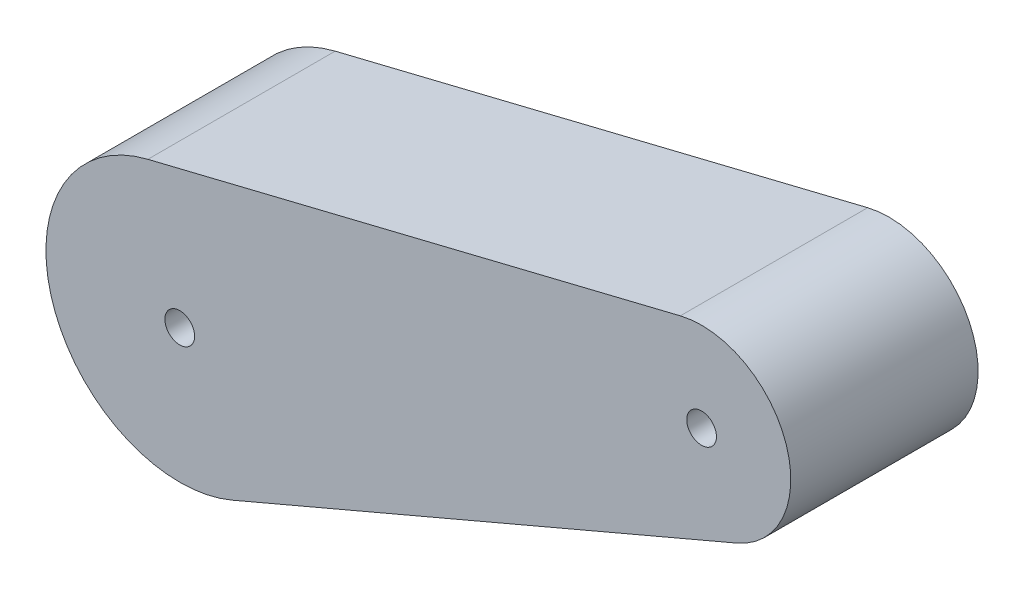
ISO-10303-21;
HEADER;
FILE_DESCRIPTION(('STEP AP214'),'2;1');
FILE_NAME('part.step','',(''),(''),'','','');
FILE_SCHEMA(('AUTOMOTIVE_DESIGN { 1 0 10303 214 1 1 1 1 }'));
ENDSEC;
DATA;
#1=APPLICATION_CONTEXT('core data for automotive mechanical design processes');
#2=APPLICATION_PROTOCOL_DEFINITION('international standard','automotive_design',2000,#1);
#3=PRODUCT_CONTEXT('',#1,'mechanical');
#4=PRODUCT('Part','Part','',(#3));
#5=PRODUCT_RELATED_PRODUCT_CATEGORY('part','',(#4));
#6=PRODUCT_DEFINITION_FORMATION('','',#4);
#7=PRODUCT_DEFINITION_CONTEXT('part definition',#1,'design');
#8=PRODUCT_DEFINITION('design','',#6,#7);
#9=PRODUCT_DEFINITION_SHAPE('','',#8);
#10=(LENGTH_UNIT() NAMED_UNIT(*) SI_UNIT(.MILLI.,.METRE.));
#11=(NAMED_UNIT(*) PLANE_ANGLE_UNIT() SI_UNIT($,.RADIAN.));
#12=(NAMED_UNIT(*) SI_UNIT($,.STERADIAN.) SOLID_ANGLE_UNIT());
#13=UNCERTAINTY_MEASURE_WITH_UNIT(LENGTH_MEASURE(1.E-05),#10,'distance_accuracy_value','');
#14=(GEOMETRIC_REPRESENTATION_CONTEXT(3) GLOBAL_UNCERTAINTY_ASSIGNED_CONTEXT((#13)) GLOBAL_UNIT_ASSIGNED_CONTEXT((#10,
#11,#12)) REPRESENTATION_CONTEXT('',''));
#15=CARTESIAN_POINT('',(0.,0.,0.));
#16=DIRECTION('',(0.,0.,1.));
#17=DIRECTION('',(1.,0.,0.));
#18=AXIS2_PLACEMENT_3D('',#15,#16,#17);
#19=CARTESIAN_POINT('',(0.,0.,31.5));
#20=DIRECTION('',(0.,0.,1.));
#21=DIRECTION('',(1.,0.,0.));
#22=AXIS2_PLACEMENT_3D('',#19,#20,#21);
#23=PLANE('',#22);
#24=CARTESIAN_POINT('',(175.503634341575,58.5104634479909,31.5));
#25=DIRECTION('',(0.,0.,1.));
#26=DIRECTION('',(1.,0.,0.));
#27=AXIS2_PLACEMENT_3D('',#24,#25,#26);
#28=CIRCLE('',#27,5.00000000000002);
#29=CARTESIAN_POINT('',(180.503634341575,58.5104634479909,31.5));
#30=VERTEX_POINT('',#29);
#31=EDGE_CURVE('E100',#30,#30,#28,.T.);
#32=ORIENTED_EDGE('',*,*,#31,.F.);
#33=EDGE_LOOP('',(#32));
#34=FACE_BOUND('',#33,.T.);
#35=CARTESIAN_POINT('',(0.,0.,31.5));
#36=DIRECTION('',(0.,0.,1.));
#37=DIRECTION('',(1.,0.,0.));
#38=AXIS2_PLACEMENT_3D('',#35,#36,#37);
#39=CIRCLE('',#38,45.);
#40=CARTESIAN_POINT('',(-10.7240579663241,43.7034847664911,31.5));
#41=VERTEX_POINT('',#40);
#42=CARTESIAN_POINT('',(17.6467725422518,-41.3955482973958,31.5));
#43=VERTEX_POINT('',#42);
#44=EDGE_CURVE('E85',#41,#43,#39,.T.);
#45=ORIENTED_EDGE('',*,*,#44,.T.);
#46=DIRECTION('',(0.919901073275462,0.39215050093893,0.));
#47=VECTOR('',#46,1.);
#48=CARTESIAN_POINT('',(17.6467725422518,-41.3955482973958,31.5));
#49=LINE('',#48,#47);
#50=CARTESIAN_POINT('',(187.268149369743,30.913431249727,31.5));
#51=VERTEX_POINT('',#50);
#52=EDGE_CURVE('E80',#43,#51,#49,.T.);
#53=ORIENTED_EDGE('',*,*,#52,.T.);
#54=CARTESIAN_POINT('',(175.503634341575,58.5104634479909,31.5));
#55=DIRECTION('',(0.,0.,1.));
#56=DIRECTION('',(1.,0.,0.));
#57=AXIS2_PLACEMENT_3D('',#54,#55,#56);
#58=CIRCLE('',#57,30.);
#59=CARTESIAN_POINT('',(168.354262364026,87.6461199589849,31.5));
#60=VERTEX_POINT('',#59);
#61=EDGE_CURVE('E83',#51,#60,#58,.T.);
#62=ORIENTED_EDGE('',*,*,#61,.T.);
#63=DIRECTION('',(-0.971188550366469,-0.238312399251647,0.));
#64=VECTOR('',#63,1.);
#65=CARTESIAN_POINT('',(-10.7240579663241,43.7034847664911,31.5));
#66=LINE('',#65,#64);
#67=EDGE_CURVE('E50',#60,#41,#66,.T.);
#68=ORIENTED_EDGE('',*,*,#67,.T.);
#69=EDGE_LOOP('',(#45,#53,#62,#68));
#70=FACE_BOUND('',#69,.T.);
#71=CARTESIAN_POINT('',(0.,0.,31.5));
#72=DIRECTION('',(0.,0.,1.));
#73=DIRECTION('',(1.,0.,0.));
#74=AXIS2_PLACEMENT_3D('',#71,#72,#73);
#75=CIRCLE('',#74,5.);
#76=CARTESIAN_POINT('',(5.,0.,31.5));
#77=VERTEX_POINT('',#76);
#78=EDGE_CURVE('E115',#77,#77,#75,.T.);
#79=ORIENTED_EDGE('',*,*,#78,.F.);
#80=EDGE_LOOP('',(#79));
#81=FACE_BOUND('',#80,.T.);
#82=ADVANCED_FACE('F33',(#34,#70,#81),#23,.T.);
#83=CARTESIAN_POINT('',(0.,0.,-31.5));
#84=DIRECTION('',(0.,0.,1.));
#85=DIRECTION('',(1.,0.,0.));
#86=AXIS2_PLACEMENT_3D('',#83,#84,#85);
#87=PLANE('',#86);
#88=CARTESIAN_POINT('',(0.,0.,-31.5));
#89=DIRECTION('',(0.,0.,1.));
#90=DIRECTION('',(1.,0.,0.));
#91=AXIS2_PLACEMENT_3D('',#88,#89,#90);
#92=CIRCLE('',#91,45.);
#93=CARTESIAN_POINT('',(-10.7240579663241,43.7034847664911,-31.5));
#94=VERTEX_POINT('',#93);
#95=CARTESIAN_POINT('',(17.6467725422518,-41.3955482973958,-31.5));
#96=VERTEX_POINT('',#95);
#97=EDGE_CURVE('E97',#94,#96,#92,.T.);
#98=ORIENTED_EDGE('',*,*,#97,.F.);
#99=DIRECTION('',(-0.971188550366469,-0.238312399251647,0.));
#100=VECTOR('',#99,1.);
#101=CARTESIAN_POINT('',(-10.7240579663241,43.7034847664911,-31.5));
#102=LINE('',#101,#100);
#103=CARTESIAN_POINT('',(168.354262364026,87.6461199589849,-31.5));
#104=VERTEX_POINT('',#103);
#105=EDGE_CURVE('E73',#104,#94,#102,.T.);
#106=ORIENTED_EDGE('',*,*,#105,.F.);
#107=CARTESIAN_POINT('',(175.503634341575,58.5104634479909,-31.5));
#108=DIRECTION('',(0.,0.,1.));
#109=DIRECTION('',(1.,0.,0.));
#110=AXIS2_PLACEMENT_3D('',#107,#108,#109);
#111=CIRCLE('',#110,30.);
#112=CARTESIAN_POINT('',(187.268149369743,30.913431249727,-31.5));
#113=VERTEX_POINT('',#112);
#114=EDGE_CURVE('E67',#113,#104,#111,.T.);
#115=ORIENTED_EDGE('',*,*,#114,.F.);
#116=DIRECTION('',(0.919901073275462,0.39215050093893,0.));
#117=VECTOR('',#116,1.);
#118=CARTESIAN_POINT('',(17.6467725422518,-41.3955482973958,-31.5));
#119=LINE('',#118,#117);
#120=EDGE_CURVE('E89',#96,#113,#119,.T.);
#121=ORIENTED_EDGE('',*,*,#120,.F.);
#122=EDGE_LOOP('',(#98,#106,#115,#121));
#123=FACE_BOUND('',#122,.T.);
#124=CARTESIAN_POINT('',(175.503634341575,58.5104634479909,-31.5));
#125=DIRECTION('',(0.,0.,1.));
#126=DIRECTION('',(1.,0.,0.));
#127=AXIS2_PLACEMENT_3D('',#124,#125,#126);
#128=CIRCLE('',#127,5.00000000000002);
#129=CARTESIAN_POINT('',(180.503634341575,58.5104634479909,-31.5));
#130=VERTEX_POINT('',#129);
#131=EDGE_CURVE('E112',#130,#130,#128,.T.);
#132=ORIENTED_EDGE('',*,*,#131,.T.);
#133=EDGE_LOOP('',(#132));
#134=FACE_BOUND('',#133,.T.);
#135=CARTESIAN_POINT('',(0.,0.,-31.5));
#136=DIRECTION('',(0.,0.,1.));
#137=DIRECTION('',(1.,0.,0.));
#138=AXIS2_PLACEMENT_3D('',#135,#136,#137);
#139=CIRCLE('',#138,5.);
#140=CARTESIAN_POINT('',(5.,0.,-31.5));
#141=VERTEX_POINT('',#140);
#142=EDGE_CURVE('E118',#141,#141,#139,.T.);
#143=ORIENTED_EDGE('',*,*,#142,.T.);
#144=EDGE_LOOP('',(#143));
#145=FACE_BOUND('',#144,.T.);
#146=ADVANCED_FACE('F108',(#123,#134,#145),#87,.F.);
#147=CARTESIAN_POINT('',(0.,0.,31.5));
#148=DIRECTION('',(0.,0.,-1.));
#149=DIRECTION('',(-1.,0.,0.));
#150=AXIS2_PLACEMENT_3D('',#147,#148,#149);
#151=CYLINDRICAL_SURFACE('',#150,45.);
#152=ORIENTED_EDGE('',*,*,#97,.T.);
#153=DIRECTION('',(0.,0.,-1.));
#154=VECTOR('',#153,1.);
#155=CARTESIAN_POINT('',(17.6467725422518,-41.3955482973958,31.5));
#156=LINE('',#155,#154);
#157=EDGE_CURVE('E11',#43,#96,#156,.T.);
#158=ORIENTED_EDGE('',*,*,#157,.F.);
#159=ORIENTED_EDGE('',*,*,#44,.F.);
#160=DIRECTION('',(0.,0.,-1.));
#161=VECTOR('',#160,1.);
#162=CARTESIAN_POINT('',(-10.7240579663241,43.7034847664911,31.5));
#163=LINE('',#162,#161);
#164=EDGE_CURVE('E93',#41,#94,#163,.T.);
#165=ORIENTED_EDGE('',*,*,#164,.T.);
#166=EDGE_LOOP('',(#152,#158,#159,#165));
#167=FACE_BOUND('',#166,.T.);
#168=ADVANCED_FACE('F35',(#167),#151,.T.);
#169=CARTESIAN_POINT('',(17.6467725422518,-41.3955482973958,31.5));
#170=DIRECTION('',(-0.39215050093893,0.919901073275462,0.));
#171=DIRECTION('',(-0.919901073275462,-0.39215050093893,0.));
#172=AXIS2_PLACEMENT_3D('',#169,#170,#171);
#173=PLANE('',#172);
#174=ORIENTED_EDGE('',*,*,#120,.T.);
#175=DIRECTION('',(0.,0.,-1.));
#176=VECTOR('',#175,1.);
#177=CARTESIAN_POINT('',(187.268149369743,30.913431249727,31.5));
#178=LINE('',#177,#176);
#179=EDGE_CURVE('E42',#51,#113,#178,.T.);
#180=ORIENTED_EDGE('',*,*,#179,.F.);
#181=ORIENTED_EDGE('',*,*,#52,.F.);
#182=ORIENTED_EDGE('',*,*,#157,.T.);
#183=EDGE_LOOP('',(#174,#180,#181,#182));
#184=FACE_BOUND('',#183,.T.);
#185=ADVANCED_FACE('F88',(#184),#173,.F.);
#186=CARTESIAN_POINT('',(175.503634341575,58.5104634479909,31.5));
#187=DIRECTION('',(0.,0.,-1.));
#188=DIRECTION('',(-1.,0.,0.));
#189=AXIS2_PLACEMENT_3D('',#186,#187,#188);
#190=CYLINDRICAL_SURFACE('',#189,30.);
#191=ORIENTED_EDGE('',*,*,#114,.T.);
#192=DIRECTION('',(0.,0.,-1.));
#193=VECTOR('',#192,1.);
#194=CARTESIAN_POINT('',(168.354262364026,87.6461199589849,31.5));
#195=LINE('',#194,#193);
#196=EDGE_CURVE('E90',#60,#104,#195,.T.);
#197=ORIENTED_EDGE('',*,*,#196,.F.);
#198=ORIENTED_EDGE('',*,*,#61,.F.);
#199=ORIENTED_EDGE('',*,*,#179,.T.);
#200=EDGE_LOOP('',(#191,#197,#198,#199));
#201=FACE_BOUND('',#200,.T.);
#202=ADVANCED_FACE('F91',(#201),#190,.T.);
#203=CARTESIAN_POINT('',(-10.7240579663241,43.7034847664911,31.5));
#204=DIRECTION('',(0.238312399251647,-0.971188550366469,0.));
#205=DIRECTION('',(0.971188550366469,0.238312399251647,0.));
#206=AXIS2_PLACEMENT_3D('',#203,#204,#205);
#207=PLANE('',#206);
#208=ORIENTED_EDGE('',*,*,#105,.T.);
#209=ORIENTED_EDGE('',*,*,#164,.F.);
#210=ORIENTED_EDGE('',*,*,#67,.F.);
#211=ORIENTED_EDGE('',*,*,#196,.T.);
#212=EDGE_LOOP('',(#208,#209,#210,#211));
#213=FACE_BOUND('',#212,.T.);
#214=ADVANCED_FACE('F105',(#213),#207,.F.);
#215=CARTESIAN_POINT('',(175.503634341575,58.5104634479909,31.5));
#216=DIRECTION('',(0.,0.,-1.));
#217=DIRECTION('',(-1.,0.,0.));
#218=AXIS2_PLACEMENT_3D('',#215,#216,#217);
#219=CYLINDRICAL_SURFACE('',#218,5.00000000000002);
#220=ORIENTED_EDGE('',*,*,#31,.T.);
#221=EDGE_LOOP('',(#220));
#222=FACE_BOUND('',#221,.T.);
#223=ORIENTED_EDGE('',*,*,#131,.F.);
#224=EDGE_LOOP('',(#223));
#225=FACE_BOUND('',#224,.T.);
#226=ADVANCED_FACE('F135',(#222,#225),#219,.F.);
#227=CARTESIAN_POINT('',(0.,0.,31.5));
#228=DIRECTION('',(0.,0.,-1.));
#229=DIRECTION('',(-1.,0.,0.));
#230=AXIS2_PLACEMENT_3D('',#227,#228,#229);
#231=CYLINDRICAL_SURFACE('',#230,5.);
#232=ORIENTED_EDGE('',*,*,#78,.T.);
#233=EDGE_LOOP('',(#232));
#234=FACE_BOUND('',#233,.T.);
#235=ORIENTED_EDGE('',*,*,#142,.F.);
#236=EDGE_LOOP('',(#235));
#237=FACE_BOUND('',#236,.T.);
#238=ADVANCED_FACE('F124',(#234,#237),#231,.F.);
#239=CLOSED_SHELL('',(#82,#146,#168,#185,#202,#214,#226,#238));
#240=MANIFOLD_SOLID_BREP('B2',#239);
#241=ADVANCED_BREP_SHAPE_REPRESENTATION('',(#18,#240),#14);
#242=SHAPE_DEFINITION_REPRESENTATION(#9,#241);
ENDSEC;
END-ISO-10303-21;
